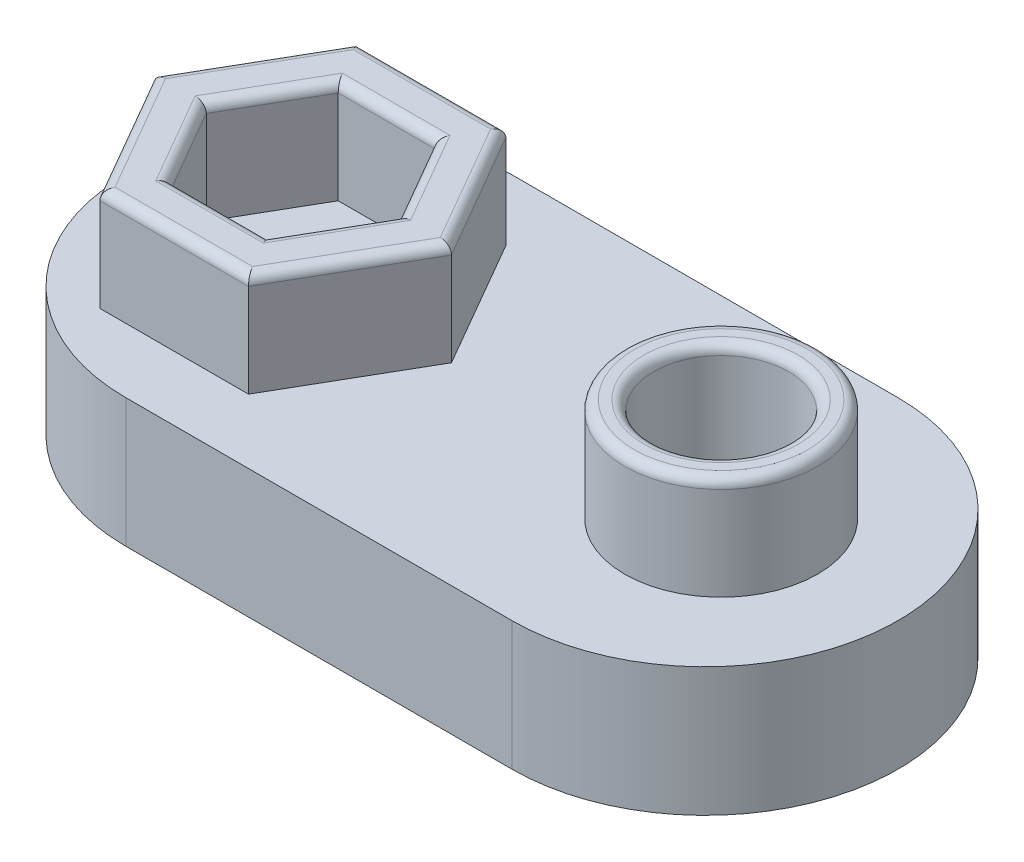
ISO-10303-21;
HEADER;
FILE_DESCRIPTION(('STEP AP214'),'2;1');
FILE_NAME('part.step','',(''),(''),'','','');
FILE_SCHEMA(('AUTOMOTIVE_DESIGN { 1 0 10303 214 1 1 1 1 }'));
ENDSEC;
DATA;
#1=APPLICATION_CONTEXT('core data for automotive mechanical design processes');
#2=APPLICATION_PROTOCOL_DEFINITION('international standard','automotive_design',2000,#1);
#3=PRODUCT_CONTEXT('',#1,'mechanical');
#4=PRODUCT('Part','Part','',(#3));
#5=PRODUCT_RELATED_PRODUCT_CATEGORY('part','',(#4));
#6=PRODUCT_DEFINITION_FORMATION('','',#4);
#7=PRODUCT_DEFINITION_CONTEXT('part definition',#1,'design');
#8=PRODUCT_DEFINITION('design','',#6,#7);
#9=PRODUCT_DEFINITION_SHAPE('','',#8);
#10=(LENGTH_UNIT() NAMED_UNIT(*) SI_UNIT(.MILLI.,.METRE.));
#11=(NAMED_UNIT(*) PLANE_ANGLE_UNIT() SI_UNIT($,.RADIAN.));
#12=(NAMED_UNIT(*) SI_UNIT($,.STERADIAN.) SOLID_ANGLE_UNIT());
#13=UNCERTAINTY_MEASURE_WITH_UNIT(LENGTH_MEASURE(1.E-05),#10,'distance_accuracy_value','');
#14=(GEOMETRIC_REPRESENTATION_CONTEXT(3) GLOBAL_UNCERTAINTY_ASSIGNED_CONTEXT((#13)) GLOBAL_UNIT_ASSIGNED_CONTEXT((#10,
#11,#12)) REPRESENTATION_CONTEXT('',''));
#15=CARTESIAN_POINT('',(0.,0.,0.));
#16=DIRECTION('',(0.,0.,1.));
#17=DIRECTION('',(1.,0.,0.));
#18=AXIS2_PLACEMENT_3D('',#15,#16,#17);
#19=CARTESIAN_POINT('',(-6.,4.,0.));
#20=DIRECTION('',(0.,-1.,0.));
#21=DIRECTION('',(0.,0.,-1.));
#22=AXIS2_PLACEMENT_3D('',#19,#20,#21);
#23=PLANE('',#22);
#24=CARTESIAN_POINT('',(6.5,4.,0.));
#25=DIRECTION('',(0.,-1.,0.));
#26=DIRECTION('',(0.,0.,-1.));
#27=AXIS2_PLACEMENT_3D('',#24,#25,#26);
#28=CIRCLE('',#27,3.);
#29=CARTESIAN_POINT('',(6.5,4.,-3.));
#30=VERTEX_POINT('',#29);
#31=EDGE_CURVE('E297',#30,#30,#28,.F.);
#32=ORIENTED_EDGE('',*,*,#31,.F.);
#33=EDGE_LOOP('',(#32));
#34=FACE_BOUND('',#33,.T.);
#35=CARTESIAN_POINT('',(-6.,4.,0.));
#36=DIRECTION('',(0.,1.,0.));
#37=DIRECTION('',(0.,0.,-1.));
#38=AXIS2_PLACEMENT_3D('',#35,#36,#37);
#39=CIRCLE('',#38,6.);
#40=CARTESIAN_POINT('',(-6.,4.,-6.));
#41=VERTEX_POINT('',#40);
#42=CARTESIAN_POINT('',(-6.,4.,6.));
#43=VERTEX_POINT('',#42);
#44=EDGE_CURVE('E268',#41,#43,#39,.T.);
#45=ORIENTED_EDGE('',*,*,#44,.T.);
#46=DIRECTION('',(1.,0.,0.));
#47=VECTOR('',#46,1.);
#48=CARTESIAN_POINT('',(6.,4.,6.));
#49=LINE('',#48,#47);
#50=CARTESIAN_POINT('',(6.,4.,6.));
#51=VERTEX_POINT('',#50);
#52=EDGE_CURVE('E271',#43,#51,#49,.T.);
#53=ORIENTED_EDGE('',*,*,#52,.T.);
#54=CARTESIAN_POINT('',(6.,4.,0.));
#55=DIRECTION('',(0.,1.,0.));
#56=DIRECTION('',(0.,0.,1.));
#57=AXIS2_PLACEMENT_3D('',#54,#55,#56);
#58=CIRCLE('',#57,6.);
#59=CARTESIAN_POINT('',(6.,4.,-6.));
#60=VERTEX_POINT('',#59);
#61=EDGE_CURVE('E274',#51,#60,#58,.T.);
#62=ORIENTED_EDGE('',*,*,#61,.T.);
#63=DIRECTION('',(-1.,0.,0.));
#64=VECTOR('',#63,1.);
#65=CARTESIAN_POINT('',(6.,4.,-6.));
#66=LINE('',#65,#64);
#67=EDGE_CURVE('E276',#60,#41,#66,.T.);
#68=ORIENTED_EDGE('',*,*,#67,.T.);
#69=EDGE_LOOP('',(#45,#53,#62,#68));
#70=FACE_BOUND('',#69,.T.);
#71=DIRECTION('',(0.5,0.,-0.866025403784439));
#72=VECTOR('',#71,1.);
#73=CARTESIAN_POINT('',(-4.19059892324149,4.,4.));
#74=LINE('',#73,#72);
#75=CARTESIAN_POINT('',(-4.19059892324149,4.,4.));
#76=VERTEX_POINT('',#75);
#77=CARTESIAN_POINT('',(-1.88119784648299,4.,0.));
#78=VERTEX_POINT('',#77);
#79=EDGE_CURVE('E197',#76,#78,#74,.T.);
#80=ORIENTED_EDGE('',*,*,#79,.F.);
#81=DIRECTION('',(1.,0.,0.));
#82=VECTOR('',#81,1.);
#83=CARTESIAN_POINT('',(-8.8094010767585,4.,4.));
#84=LINE('',#83,#82);
#85=CARTESIAN_POINT('',(-8.8094010767585,4.,4.));
#86=VERTEX_POINT('',#85);
#87=EDGE_CURVE('E249',#86,#76,#84,.T.);
#88=ORIENTED_EDGE('',*,*,#87,.F.);
#89=DIRECTION('',(0.5,0.,0.866025403784439));
#90=VECTOR('',#89,1.);
#91=CARTESIAN_POINT('',(-11.118802153517,4.,0.));
#92=LINE('',#91,#90);
#93=CARTESIAN_POINT('',(-11.118802153517,4.,0.));
#94=VERTEX_POINT('',#93);
#95=EDGE_CURVE('E246',#94,#86,#92,.T.);
#96=ORIENTED_EDGE('',*,*,#95,.F.);
#97=DIRECTION('',(-0.5,0.,0.866025403784439));
#98=VECTOR('',#97,1.);
#99=CARTESIAN_POINT('',(-8.8094010767585,4.,-4.));
#100=LINE('',#99,#98);
#101=CARTESIAN_POINT('',(-8.8094010767585,4.,-4.));
#102=VERTEX_POINT('',#101);
#103=EDGE_CURVE('E243',#102,#94,#100,.T.);
#104=ORIENTED_EDGE('',*,*,#103,.F.);
#105=DIRECTION('',(-1.,0.,0.));
#106=VECTOR('',#105,1.);
#107=CARTESIAN_POINT('',(-4.1905989232415,4.,-4.));
#108=LINE('',#107,#106);
#109=CARTESIAN_POINT('',(-4.1905989232415,4.,-4.));
#110=VERTEX_POINT('',#109);
#111=EDGE_CURVE('E240',#110,#102,#108,.T.);
#112=ORIENTED_EDGE('',*,*,#111,.F.);
#113=DIRECTION('',(-0.5,0.,-0.866025403784438));
#114=VECTOR('',#113,1.);
#115=CARTESIAN_POINT('',(-1.88119784648299,4.,0.));
#116=LINE('',#115,#114);
#117=EDGE_CURVE('E237',#78,#110,#116,.T.);
#118=ORIENTED_EDGE('',*,*,#117,.F.);
#119=EDGE_LOOP('',(#80,#88,#96,#104,#112,#118));
#120=FACE_BOUND('',#119,.T.);
#121=ADVANCED_FACE('F36',(#34,#70,#120),#23,.F.);
#122=CARTESIAN_POINT('',(-6.,4.,0.));
#123=DIRECTION('',(0.,-1.,0.));
#124=DIRECTION('',(0.,0.,-1.));
#125=AXIS2_PLACEMENT_3D('',#122,#123,#124);
#126=CYLINDRICAL_SURFACE('',#125,6.);
#127=CARTESIAN_POINT('',(-6.,0.,0.));
#128=DIRECTION('',(0.,1.,0.));
#129=DIRECTION('',(0.,0.,-1.));
#130=AXIS2_PLACEMENT_3D('',#127,#128,#129);
#131=CIRCLE('',#130,6.);
#132=CARTESIAN_POINT('',(-6.,0.,-6.));
#133=VERTEX_POINT('',#132);
#134=CARTESIAN_POINT('',(-6.,0.,6.));
#135=VERTEX_POINT('',#134);
#136=EDGE_CURVE('E267',#133,#135,#131,.T.);
#137=ORIENTED_EDGE('',*,*,#136,.T.);
#138=DIRECTION('',(0.,-1.,0.));
#139=VECTOR('',#138,1.);
#140=CARTESIAN_POINT('',(-6.,4.,6.));
#141=LINE('',#140,#139);
#142=EDGE_CURVE('E294',#43,#135,#141,.T.);
#143=ORIENTED_EDGE('',*,*,#142,.F.);
#144=ORIENTED_EDGE('',*,*,#44,.F.);
#145=DIRECTION('',(0.,-1.,0.));
#146=VECTOR('',#145,1.);
#147=CARTESIAN_POINT('',(-6.,4.,-6.));
#148=LINE('',#147,#146);
#149=EDGE_CURVE('E278',#41,#133,#148,.T.);
#150=ORIENTED_EDGE('',*,*,#149,.T.);
#151=EDGE_LOOP('',(#137,#143,#144,#150));
#152=FACE_BOUND('',#151,.T.);
#153=ADVANCED_FACE('F440',(#152),#126,.T.);
#154=CARTESIAN_POINT('',(6.,4.,6.));
#155=DIRECTION('',(0.,0.,-1.));
#156=DIRECTION('',(-1.,0.,0.));
#157=AXIS2_PLACEMENT_3D('',#154,#155,#156);
#158=PLANE('',#157);
#159=DIRECTION('',(1.,0.,0.));
#160=VECTOR('',#159,1.);
#161=CARTESIAN_POINT('',(6.,0.,6.));
#162=LINE('',#161,#160);
#163=CARTESIAN_POINT('',(6.,0.,6.));
#164=VERTEX_POINT('',#163);
#165=EDGE_CURVE('E281',#135,#164,#162,.T.);
#166=ORIENTED_EDGE('',*,*,#165,.T.);
#167=DIRECTION('',(0.,-1.,0.));
#168=VECTOR('',#167,1.);
#169=CARTESIAN_POINT('',(6.,4.,6.));
#170=LINE('',#169,#168);
#171=EDGE_CURVE('E291',#51,#164,#170,.T.);
#172=ORIENTED_EDGE('',*,*,#171,.F.);
#173=ORIENTED_EDGE('',*,*,#52,.F.);
#174=ORIENTED_EDGE('',*,*,#142,.T.);
#175=EDGE_LOOP('',(#166,#172,#173,#174));
#176=FACE_BOUND('',#175,.T.);
#177=ADVANCED_FACE('F447',(#176),#158,.F.);
#178=CARTESIAN_POINT('',(6.,4.,0.));
#179=DIRECTION('',(0.,-1.,0.));
#180=DIRECTION('',(0.,0.,-1.));
#181=AXIS2_PLACEMENT_3D('',#178,#179,#180);
#182=CYLINDRICAL_SURFACE('',#181,6.);
#183=CARTESIAN_POINT('',(6.,0.,0.));
#184=DIRECTION('',(0.,1.,0.));
#185=DIRECTION('',(0.,0.,1.));
#186=AXIS2_PLACEMENT_3D('',#183,#184,#185);
#187=CIRCLE('',#186,6.);
#188=CARTESIAN_POINT('',(6.,0.,-6.));
#189=VERTEX_POINT('',#188);
#190=EDGE_CURVE('E283',#164,#189,#187,.T.);
#191=ORIENTED_EDGE('',*,*,#190,.T.);
#192=DIRECTION('',(0.,-1.,0.));
#193=VECTOR('',#192,1.);
#194=CARTESIAN_POINT('',(6.,4.,-6.));
#195=LINE('',#194,#193);
#196=EDGE_CURVE('E288',#60,#189,#195,.T.);
#197=ORIENTED_EDGE('',*,*,#196,.F.);
#198=ORIENTED_EDGE('',*,*,#61,.F.);
#199=ORIENTED_EDGE('',*,*,#171,.T.);
#200=EDGE_LOOP('',(#191,#197,#198,#199));
#201=FACE_BOUND('',#200,.T.);
#202=ADVANCED_FACE('F661',(#201),#182,.T.);
#203=CARTESIAN_POINT('',(6.,4.,-6.));
#204=DIRECTION('',(0.,0.,1.));
#205=DIRECTION('',(1.,0.,0.));
#206=AXIS2_PLACEMENT_3D('',#203,#204,#205);
#207=PLANE('',#206);
#208=DIRECTION('',(-1.,0.,0.));
#209=VECTOR('',#208,1.);
#210=CARTESIAN_POINT('',(6.,0.,-6.));
#211=LINE('',#210,#209);
#212=EDGE_CURVE('E272',#189,#133,#211,.T.);
#213=ORIENTED_EDGE('',*,*,#212,.T.);
#214=ORIENTED_EDGE('',*,*,#149,.F.);
#215=ORIENTED_EDGE('',*,*,#67,.F.);
#216=ORIENTED_EDGE('',*,*,#196,.T.);
#217=EDGE_LOOP('',(#213,#214,#215,#216));
#218=FACE_BOUND('',#217,.T.);
#219=ADVANCED_FACE('F665',(#218),#207,.F.);
#220=CARTESIAN_POINT('',(-6.,0.,0.));
#221=DIRECTION('',(0.,-1.,0.));
#222=DIRECTION('',(0.,0.,-1.));
#223=AXIS2_PLACEMENT_3D('',#220,#221,#222);
#224=PLANE('',#223);
#225=ORIENTED_EDGE('',*,*,#136,.F.);
#226=ORIENTED_EDGE('',*,*,#212,.F.);
#227=ORIENTED_EDGE('',*,*,#190,.F.);
#228=ORIENTED_EDGE('',*,*,#165,.F.);
#229=EDGE_LOOP('',(#225,#226,#227,#228));
#230=FACE_BOUND('',#229,.T.);
#231=ADVANCED_FACE('F668',(#230),#224,.T.);
#232=CARTESIAN_POINT('',(6.5,7.2,0.));
#233=DIRECTION('',(0.,1.,0.));
#234=DIRECTION('',(0.,0.,1.));
#235=AXIS2_PLACEMENT_3D('',#232,#233,#234);
#236=PLANE('',#235);
#237=CARTESIAN_POINT('',(6.5,7.2,0.));
#238=DIRECTION('',(0.,1.,0.));
#239=DIRECTION('',(0.,0.,1.));
#240=AXIS2_PLACEMENT_3D('',#237,#238,#239);
#241=CIRCLE('',#240,2.4);
#242=CARTESIAN_POINT('',(6.5,7.2,2.4));
#243=VERTEX_POINT('',#242);
#244=EDGE_CURVE('E306',#243,#243,#241,.F.);
#245=ORIENTED_EDGE('',*,*,#244,.T.);
#246=EDGE_LOOP('',(#245));
#247=FACE_BOUND('',#246,.T.);
#248=CARTESIAN_POINT('',(6.5,7.2,0.));
#249=DIRECTION('',(0.,1.,0.));
#250=DIRECTION('',(0.,0.,1.));
#251=AXIS2_PLACEMENT_3D('',#248,#249,#250);
#252=CIRCLE('',#251,2.7);
#253=CARTESIAN_POINT('',(6.5,7.2,2.7));
#254=VERTEX_POINT('',#253);
#255=EDGE_CURVE('E303',#254,#254,#252,.T.);
#256=ORIENTED_EDGE('',*,*,#255,.T.);
#257=EDGE_LOOP('',(#256));
#258=FACE_BOUND('',#257,.T.);
#259=ADVANCED_FACE('F671',(#247,#258),#236,.T.);
#260=CARTESIAN_POINT('',(6.5,7.2,0.));
#261=DIRECTION('',(0.,-1.,0.));
#262=DIRECTION('',(0.,0.,-1.));
#263=AXIS2_PLACEMENT_3D('',#260,#261,#262);
#264=CYLINDRICAL_SURFACE('',#263,3.);
#265=CARTESIAN_POINT('',(6.5,6.9,0.));
#266=DIRECTION('',(0.,1.,0.));
#267=DIRECTION('',(0.,0.,1.));
#268=AXIS2_PLACEMENT_3D('',#265,#266,#267);
#269=CIRCLE('',#268,3.);
#270=CARTESIAN_POINT('',(6.5,6.9,3.));
#271=VERTEX_POINT('',#270);
#272=EDGE_CURVE('E309',#271,#271,#269,.F.);
#273=ORIENTED_EDGE('',*,*,#272,.T.);
#274=EDGE_LOOP('',(#273));
#275=FACE_BOUND('',#274,.T.);
#276=ORIENTED_EDGE('',*,*,#31,.T.);
#277=EDGE_LOOP('',(#276));
#278=FACE_BOUND('',#277,.T.);
#279=ADVANCED_FACE('F676',(#275,#278),#264,.T.);
#280=CARTESIAN_POINT('',(6.5,7.2,0.));
#281=DIRECTION('',(0.,-1.,0.));
#282=DIRECTION('',(0.,0.,-1.));
#283=AXIS2_PLACEMENT_3D('',#280,#281,#282);
#284=CYLINDRICAL_SURFACE('',#283,2.1);
#285=CARTESIAN_POINT('',(6.5,6.9,0.));
#286=DIRECTION('',(0.,1.,0.));
#287=DIRECTION('',(0.,0.,1.));
#288=AXIS2_PLACEMENT_3D('',#285,#286,#287);
#289=CIRCLE('',#288,2.1);
#290=CARTESIAN_POINT('',(6.5,6.9,2.1));
#291=VERTEX_POINT('',#290);
#292=EDGE_CURVE('E300',#291,#291,#289,.T.);
#293=ORIENTED_EDGE('',*,*,#292,.T.);
#294=EDGE_LOOP('',(#293));
#295=FACE_BOUND('',#294,.T.);
#296=CARTESIAN_POINT('',(6.5,4.,0.));
#297=DIRECTION('',(0.,1.,0.));
#298=DIRECTION('',(0.,0.,1.));
#299=AXIS2_PLACEMENT_3D('',#296,#297,#298);
#300=CIRCLE('',#299,2.1);
#301=CARTESIAN_POINT('',(6.5,4.,2.1));
#302=VERTEX_POINT('',#301);
#303=EDGE_CURVE('E264',#302,#302,#300,.T.);
#304=ORIENTED_EDGE('',*,*,#303,.F.);
#305=EDGE_LOOP('',(#304));
#306=FACE_BOUND('',#305,.T.);
#307=ADVANCED_FACE('F455',(#295,#306),#284,.F.);
#308=ORIENTED_EDGE('',*,*,#303,.T.);
#309=EDGE_LOOP('',(#308));
#310=FACE_BOUND('',#309,.T.);
#311=ADVANCED_FACE('F443',(#310),#23,.F.);
#312=CARTESIAN_POINT('',(0.,7.2,0.));
#313=DIRECTION('',(0.,1.,0.));
#314=DIRECTION('',(0.,0.,1.));
#315=AXIS2_PLACEMENT_3D('',#312,#313,#314);
#316=PLANE('',#315);
#317=DIRECTION('',(-0.5,0.,0.866025403784439));
#318=VECTOR('',#317,1.);
#319=CARTESIAN_POINT('',(-7.38647367097487,7.2,-4.26458256229943));
#320=LINE('',#319,#318);
#321=CARTESIAN_POINT('',(-9.84863156129983,7.2,0.));
#322=VERTEX_POINT('',#321);
#323=CARTESIAN_POINT('',(-8.17431578064991,7.2,-2.9));
#324=VERTEX_POINT('',#323);
#325=EDGE_CURVE('E336',#322,#324,#320,.F.);
#326=ORIENTED_EDGE('',*,*,#325,.T.);
#327=DIRECTION('',(-1.,0.,0.));
#328=VECTOR('',#327,1.);
#329=CARTESIAN_POINT('',(0.,7.2,-2.9));
#330=LINE('',#329,#328);
#331=CARTESIAN_POINT('',(-4.82568421935009,7.2,-2.9));
#332=VERTEX_POINT('',#331);
#333=EDGE_CURVE('E338',#324,#332,#330,.F.);
#334=ORIENTED_EDGE('',*,*,#333,.T.);
#335=DIRECTION('',(-0.5,0.,-0.866025403784439));
#336=VECTOR('',#335,1.);
#337=CARTESIAN_POINT('',(-2.36352632902513,7.2,1.36458256229943));
#338=LINE('',#337,#336);
#339=CARTESIAN_POINT('',(-3.15136843870017,7.2,0.));
#340=VERTEX_POINT('',#339);
#341=EDGE_CURVE('E328',#332,#340,#338,.F.);
#342=ORIENTED_EDGE('',*,*,#341,.T.);
#343=DIRECTION('',(0.5,0.,-0.866025403784439));
#344=VECTOR('',#343,1.);
#345=CARTESIAN_POINT('',(-2.36352632902513,7.2,-1.36458256229942));
#346=LINE('',#345,#344);
#347=CARTESIAN_POINT('',(-4.82568421935008,7.2,2.9));
#348=VERTEX_POINT('',#347);
#349=EDGE_CURVE('E330',#340,#348,#346,.F.);
#350=ORIENTED_EDGE('',*,*,#349,.T.);
#351=DIRECTION('',(1.,0.,0.));
#352=VECTOR('',#351,1.);
#353=CARTESIAN_POINT('',(0.,7.2,2.9));
#354=LINE('',#353,#352);
#355=CARTESIAN_POINT('',(-8.17431578064991,7.2,2.9));
#356=VERTEX_POINT('',#355);
#357=EDGE_CURVE('E332',#348,#356,#354,.F.);
#358=ORIENTED_EDGE('',*,*,#357,.T.);
#359=DIRECTION('',(0.5,0.,0.866025403784438));
#360=VECTOR('',#359,1.);
#361=CARTESIAN_POINT('',(-7.38647367097487,7.2,4.26458256229943));
#362=LINE('',#361,#360);
#363=EDGE_CURVE('E334',#356,#322,#362,.F.);
#364=ORIENTED_EDGE('',*,*,#363,.T.);
#365=EDGE_LOOP('',(#326,#334,#342,#350,#358,#364));
#366=FACE_BOUND('',#365,.T.);
#367=DIRECTION('',(0.5,0.,0.866025403784439));
#368=VECTOR('',#367,1.);
#369=CARTESIAN_POINT('',(-8.54959345562317,7.2,3.85));
#370=LINE('',#369,#368);
#371=CARTESIAN_POINT('',(-10.7723919920032,7.2,0.));
#372=VERTEX_POINT('',#371);
#373=CARTESIAN_POINT('',(-8.63619599600161,7.2,3.7));
#374=VERTEX_POINT('',#373);
#375=EDGE_CURVE('E323',#372,#374,#370,.T.);
#376=ORIENTED_EDGE('',*,*,#375,.T.);
#377=DIRECTION('',(1.,0.,0.));
#378=VECTOR('',#377,1.);
#379=CARTESIAN_POINT('',(-4.19059892324149,7.2,3.7));
#380=LINE('',#379,#378);
#381=CARTESIAN_POINT('',(-4.36380400399838,7.2,3.7));
#382=VERTEX_POINT('',#381);
#383=EDGE_CURVE('E325',#374,#382,#380,.T.);
#384=ORIENTED_EDGE('',*,*,#383,.T.);
#385=DIRECTION('',(0.5,0.,-0.866025403784439));
#386=VECTOR('',#385,1.);
#387=CARTESIAN_POINT('',(-2.14100546761832,7.2,-0.149999999999998));
#388=LINE('',#387,#386);
#389=CARTESIAN_POINT('',(-2.22760800799677,7.2,0.));
#390=VERTEX_POINT('',#389);
#391=EDGE_CURVE('E315',#382,#390,#388,.T.);
#392=ORIENTED_EDGE('',*,*,#391,.T.);
#393=DIRECTION('',(-0.5,0.,-0.866025403784439));
#394=VECTOR('',#393,1.);
#395=CARTESIAN_POINT('',(-4.45040654437683,7.2,-3.85));
#396=LINE('',#395,#394);
#397=CARTESIAN_POINT('',(-4.36380400399839,7.2,-3.7));
#398=VERTEX_POINT('',#397);
#399=EDGE_CURVE('E317',#390,#398,#396,.T.);
#400=ORIENTED_EDGE('',*,*,#399,.T.);
#401=DIRECTION('',(-1.,0.,0.));
#402=VECTOR('',#401,1.);
#403=CARTESIAN_POINT('',(-8.8094010767585,7.2,-3.7));
#404=LINE('',#403,#402);
#405=CARTESIAN_POINT('',(-8.63619599600161,7.2,-3.7));
#406=VERTEX_POINT('',#405);
#407=EDGE_CURVE('E319',#398,#406,#404,.T.);
#408=ORIENTED_EDGE('',*,*,#407,.T.);
#409=DIRECTION('',(-0.5,0.,0.866025403784439));
#410=VECTOR('',#409,1.);
#411=CARTESIAN_POINT('',(-10.8589945323817,7.2,0.150000000000001));
#412=LINE('',#411,#410);
#413=EDGE_CURVE('E321',#406,#372,#412,.T.);
#414=ORIENTED_EDGE('',*,*,#413,.T.);
#415=EDGE_LOOP('',(#376,#384,#392,#400,#408,#414));
#416=FACE_BOUND('',#415,.T.);
#417=ADVANCED_FACE('F437',(#366,#416),#316,.T.);
#418=CARTESIAN_POINT('',(-4.19059892324149,7.2,4.));
#419=DIRECTION('',(-0.866025403784439,0.,-0.5));
#420=DIRECTION('',(-0.5,0.,0.866025403784439));
#421=AXIS2_PLACEMENT_3D('',#418,#419,#420);
#422=PLANE('',#421);
#423=DIRECTION('',(0.,-1.,0.));
#424=VECTOR('',#423,1.);
#425=CARTESIAN_POINT('',(-1.88119784648299,7.2,0.));
#426=LINE('',#425,#424);
#427=CARTESIAN_POINT('',(-1.88119784648299,6.9,0.));
#428=VERTEX_POINT('',#427);
#429=EDGE_CURVE('E262',#428,#78,#426,.T.);
#430=ORIENTED_EDGE('',*,*,#429,.F.);
#431=DIRECTION('',(0.5,0.,-0.866025403784439));
#432=VECTOR('',#431,1.);
#433=CARTESIAN_POINT('',(-4.19059892324149,6.9,4.));
#434=LINE('',#433,#432);
#435=CARTESIAN_POINT('',(-4.19059892324149,6.9,4.));
#436=VERTEX_POINT('',#435);
#437=EDGE_CURVE('E11',#428,#436,#434,.F.);
#438=ORIENTED_EDGE('',*,*,#437,.T.);
#439=DIRECTION('',(0.,-1.,0.));
#440=VECTOR('',#439,1.);
#441=CARTESIAN_POINT('',(-4.19059892324149,7.2,4.));
#442=LINE('',#441,#440);
#443=EDGE_CURVE('E252',#436,#76,#442,.T.);
#444=ORIENTED_EDGE('',*,*,#443,.T.);
#445=ORIENTED_EDGE('',*,*,#79,.T.);
#446=EDGE_LOOP('',(#430,#438,#444,#445));
#447=FACE_BOUND('',#446,.T.);
#448=ADVANCED_FACE('F403',(#447),#422,.F.);
#449=CARTESIAN_POINT('',(-1.88119784648299,7.2,0.));
#450=DIRECTION('',(-0.866025403784438,0.,0.5));
#451=DIRECTION('',(0.5,0.,0.866025403784439));
#452=AXIS2_PLACEMENT_3D('',#449,#450,#451);
#453=PLANE('',#452);
#454=DIRECTION('',(0.,-1.,0.));
#455=VECTOR('',#454,1.);
#456=CARTESIAN_POINT('',(-4.1905989232415,7.2,-4.));
#457=LINE('',#456,#455);
#458=CARTESIAN_POINT('',(-4.1905989232415,6.9,-4.));
#459=VERTEX_POINT('',#458);
#460=EDGE_CURVE('E260',#459,#110,#457,.T.);
#461=ORIENTED_EDGE('',*,*,#460,.F.);
#462=DIRECTION('',(-0.5,0.,-0.866025403784439));
#463=VECTOR('',#462,1.);
#464=CARTESIAN_POINT('',(-1.88119784648299,6.9,0.));
#465=LINE('',#464,#463);
#466=EDGE_CURVE('E45',#459,#428,#465,.F.);
#467=ORIENTED_EDGE('',*,*,#466,.T.);
#468=ORIENTED_EDGE('',*,*,#429,.T.);
#469=ORIENTED_EDGE('',*,*,#117,.T.);
#470=EDGE_LOOP('',(#461,#467,#468,#469));
#471=FACE_BOUND('',#470,.T.);
#472=ADVANCED_FACE('F429',(#471),#453,.F.);
#473=CARTESIAN_POINT('',(-4.1905989232415,7.2,-4.));
#474=DIRECTION('',(0.,0.,1.));
#475=DIRECTION('',(1.,0.,0.));
#476=AXIS2_PLACEMENT_3D('',#473,#474,#475);
#477=PLANE('',#476);
#478=DIRECTION('',(0.,-1.,0.));
#479=VECTOR('',#478,1.);
#480=CARTESIAN_POINT('',(-8.8094010767585,7.2,-4.));
#481=LINE('',#480,#479);
#482=CARTESIAN_POINT('',(-8.8094010767585,6.9,-4.));
#483=VERTEX_POINT('',#482);
#484=EDGE_CURVE('E258',#483,#102,#481,.T.);
#485=ORIENTED_EDGE('',*,*,#484,.F.);
#486=DIRECTION('',(-1.,0.,0.));
#487=VECTOR('',#486,1.);
#488=CARTESIAN_POINT('',(-4.1905989232415,6.9,-4.));
#489=LINE('',#488,#487);
#490=EDGE_CURVE('E60',#483,#459,#489,.F.);
#491=ORIENTED_EDGE('',*,*,#490,.T.);
#492=ORIENTED_EDGE('',*,*,#460,.T.);
#493=ORIENTED_EDGE('',*,*,#111,.T.);
#494=EDGE_LOOP('',(#485,#491,#492,#493));
#495=FACE_BOUND('',#494,.T.);
#496=ADVANCED_FACE('F428',(#495),#477,.F.);
#497=CARTESIAN_POINT('',(-8.8094010767585,7.2,-4.));
#498=DIRECTION('',(0.866025403784439,0.,0.5));
#499=DIRECTION('',(0.5,0.,-0.866025403784439));
#500=AXIS2_PLACEMENT_3D('',#497,#498,#499);
#501=PLANE('',#500);
#502=DIRECTION('',(0.,-1.,0.));
#503=VECTOR('',#502,1.);
#504=CARTESIAN_POINT('',(-11.118802153517,7.2,0.));
#505=LINE('',#504,#503);
#506=CARTESIAN_POINT('',(-11.118802153517,6.9,0.));
#507=VERTEX_POINT('',#506);
#508=EDGE_CURVE('E256',#507,#94,#505,.T.);
#509=ORIENTED_EDGE('',*,*,#508,.F.);
#510=DIRECTION('',(-0.5,0.,0.866025403784439));
#511=VECTOR('',#510,1.);
#512=CARTESIAN_POINT('',(-8.8094010767585,6.9,-4.));
#513=LINE('',#512,#511);
#514=EDGE_CURVE('E355',#507,#483,#513,.F.);
#515=ORIENTED_EDGE('',*,*,#514,.T.);
#516=ORIENTED_EDGE('',*,*,#484,.T.);
#517=ORIENTED_EDGE('',*,*,#103,.T.);
#518=EDGE_LOOP('',(#509,#515,#516,#517));
#519=FACE_BOUND('',#518,.T.);
#520=ADVANCED_FACE('F423',(#519),#501,.F.);
#521=CARTESIAN_POINT('',(-11.118802153517,7.2,0.));
#522=DIRECTION('',(0.866025403784439,0.,-0.5));
#523=DIRECTION('',(-0.5,0.,-0.866025403784439));
#524=AXIS2_PLACEMENT_3D('',#521,#522,#523);
#525=PLANE('',#524);
#526=DIRECTION('',(0.,-1.,0.));
#527=VECTOR('',#526,1.);
#528=CARTESIAN_POINT('',(-8.8094010767585,7.2,4.));
#529=LINE('',#528,#527);
#530=CARTESIAN_POINT('',(-8.8094010767585,6.9,4.));
#531=VERTEX_POINT('',#530);
#532=EDGE_CURVE('E254',#531,#86,#529,.T.);
#533=ORIENTED_EDGE('',*,*,#532,.F.);
#534=DIRECTION('',(0.5,0.,0.866025403784439));
#535=VECTOR('',#534,1.);
#536=CARTESIAN_POINT('',(-11.118802153517,6.9,0.));
#537=LINE('',#536,#535);
#538=EDGE_CURVE('E353',#531,#507,#537,.F.);
#539=ORIENTED_EDGE('',*,*,#538,.T.);
#540=ORIENTED_EDGE('',*,*,#508,.T.);
#541=ORIENTED_EDGE('',*,*,#95,.T.);
#542=EDGE_LOOP('',(#533,#539,#540,#541));
#543=FACE_BOUND('',#542,.T.);
#544=ADVANCED_FACE('F420',(#543),#525,.F.);
#545=CARTESIAN_POINT('',(-8.8094010767585,7.2,4.));
#546=DIRECTION('',(0.,0.,-1.));
#547=DIRECTION('',(-1.,0.,0.));
#548=AXIS2_PLACEMENT_3D('',#545,#546,#547);
#549=PLANE('',#548);
#550=ORIENTED_EDGE('',*,*,#443,.F.);
#551=DIRECTION('',(1.,0.,0.));
#552=VECTOR('',#551,1.);
#553=CARTESIAN_POINT('',(-8.8094010767585,6.9,4.));
#554=LINE('',#553,#552);
#555=EDGE_CURVE('E350',#436,#531,#554,.F.);
#556=ORIENTED_EDGE('',*,*,#555,.T.);
#557=ORIENTED_EDGE('',*,*,#532,.T.);
#558=ORIENTED_EDGE('',*,*,#87,.T.);
#559=EDGE_LOOP('',(#550,#556,#557,#558));
#560=FACE_BOUND('',#559,.T.);
#561=ADVANCED_FACE('F407',(#560),#549,.F.);
#562=CARTESIAN_POINT('',(-4.99888930010697,7.2,2.6));
#563=DIRECTION('',(-0.866025403784439,0.,-0.5));
#564=DIRECTION('',(-0.5,0.,0.866025403784439));
#565=AXIS2_PLACEMENT_3D('',#562,#563,#564);
#566=PLANE('',#565);
#567=DIRECTION('',(0.,-1.,0.));
#568=VECTOR('',#567,1.);
#569=CARTESIAN_POINT('',(-4.99888930010697,7.2,2.6));
#570=LINE('',#569,#568);
#571=CARTESIAN_POINT('',(-4.99888930010697,6.9,2.6));
#572=VERTEX_POINT('',#571);
#573=CARTESIAN_POINT('',(-4.99888930010697,4.,2.6));
#574=VERTEX_POINT('',#573);
#575=EDGE_CURVE('E226',#572,#574,#570,.T.);
#576=ORIENTED_EDGE('',*,*,#575,.F.);
#577=DIRECTION('',(0.5,0.,-0.866025403784439));
#578=VECTOR('',#577,1.);
#579=CARTESIAN_POINT('',(-4.99888930010697,6.9,2.6));
#580=LINE('',#579,#578);
#581=CARTESIAN_POINT('',(-3.49777860021394,6.9,0.));
#582=VERTEX_POINT('',#581);
#583=EDGE_CURVE('E194',#572,#582,#580,.T.);
#584=ORIENTED_EDGE('',*,*,#583,.T.);
#585=DIRECTION('',(0.,-1.,0.));
#586=VECTOR('',#585,1.);
#587=CARTESIAN_POINT('',(-3.49777860021394,7.2,0.));
#588=LINE('',#587,#586);
#589=CARTESIAN_POINT('',(-3.49777860021394,4.,0.));
#590=VERTEX_POINT('',#589);
#591=EDGE_CURVE('E186',#582,#590,#588,.T.);
#592=ORIENTED_EDGE('',*,*,#591,.T.);
#593=DIRECTION('',(0.5,0.,-0.866025403784439));
#594=VECTOR('',#593,1.);
#595=CARTESIAN_POINT('',(-4.99888930010697,4.,2.6));
#596=LINE('',#595,#594);
#597=EDGE_CURVE('E191',#574,#590,#596,.T.);
#598=ORIENTED_EDGE('',*,*,#597,.F.);
#599=EDGE_LOOP('',(#576,#584,#592,#598));
#600=FACE_BOUND('',#599,.T.);
#601=ADVANCED_FACE('F189',(#600),#566,.T.);
#602=CARTESIAN_POINT('',(-3.49777860021394,7.2,0.));
#603=DIRECTION('',(-0.866025403784439,0.,0.5));
#604=DIRECTION('',(0.5,0.,0.866025403784439));
#605=AXIS2_PLACEMENT_3D('',#602,#603,#604);
#606=PLANE('',#605);
#607=ORIENTED_EDGE('',*,*,#591,.F.);
#608=DIRECTION('',(-0.5,0.,-0.866025403784439));
#609=VECTOR('',#608,1.);
#610=CARTESIAN_POINT('',(-3.49777860021394,6.9,0.));
#611=LINE('',#610,#609);
#612=CARTESIAN_POINT('',(-4.99888930010697,6.9,-2.6));
#613=VERTEX_POINT('',#612);
#614=EDGE_CURVE('E348',#582,#613,#611,.T.);
#615=ORIENTED_EDGE('',*,*,#614,.T.);
#616=DIRECTION('',(0.,-1.,0.));
#617=VECTOR('',#616,1.);
#618=CARTESIAN_POINT('',(-4.99888930010697,7.2,-2.6));
#619=LINE('',#618,#617);
#620=CARTESIAN_POINT('',(-4.99888930010697,4.,-2.6));
#621=VERTEX_POINT('',#620);
#622=EDGE_CURVE('E198',#613,#621,#619,.T.);
#623=ORIENTED_EDGE('',*,*,#622,.T.);
#624=DIRECTION('',(-0.5,0.,-0.866025403784439));
#625=VECTOR('',#624,1.);
#626=CARTESIAN_POINT('',(-3.49777860021394,4.,0.));
#627=LINE('',#626,#625);
#628=EDGE_CURVE('E201',#590,#621,#627,.T.);
#629=ORIENTED_EDGE('',*,*,#628,.F.);
#630=EDGE_LOOP('',(#607,#615,#623,#629));
#631=FACE_BOUND('',#630,.T.);
#632=ADVANCED_FACE('F202',(#631),#606,.T.);
#633=CARTESIAN_POINT('',(-4.99888930010697,7.2,-2.6));
#634=DIRECTION('',(0.,0.,1.));
#635=DIRECTION('',(1.,0.,0.));
#636=AXIS2_PLACEMENT_3D('',#633,#634,#635);
#637=PLANE('',#636);
#638=ORIENTED_EDGE('',*,*,#622,.F.);
#639=DIRECTION('',(-1.,0.,0.));
#640=VECTOR('',#639,1.);
#641=CARTESIAN_POINT('',(-4.99888930010697,6.9,-2.6));
#642=LINE('',#641,#640);
#643=CARTESIAN_POINT('',(-8.00111069989303,6.9,-2.6));
#644=VERTEX_POINT('',#643);
#645=EDGE_CURVE('E312',#613,#644,#642,.T.);
#646=ORIENTED_EDGE('',*,*,#645,.T.);
#647=DIRECTION('',(0.,-1.,0.));
#648=VECTOR('',#647,1.);
#649=CARTESIAN_POINT('',(-8.00111069989303,7.2,-2.6));
#650=LINE('',#649,#648);
#651=CARTESIAN_POINT('',(-8.00111069989303,4.,-2.6));
#652=VERTEX_POINT('',#651);
#653=EDGE_CURVE('E232',#644,#652,#650,.T.);
#654=ORIENTED_EDGE('',*,*,#653,.T.);
#655=DIRECTION('',(-1.,0.,0.));
#656=VECTOR('',#655,1.);
#657=CARTESIAN_POINT('',(-4.99888930010697,4.,-2.6));
#658=LINE('',#657,#656);
#659=EDGE_CURVE('E207',#621,#652,#658,.T.);
#660=ORIENTED_EDGE('',*,*,#659,.F.);
#661=EDGE_LOOP('',(#638,#646,#654,#660));
#662=FACE_BOUND('',#661,.T.);
#663=ADVANCED_FACE('F480',(#662),#637,.T.);
#664=CARTESIAN_POINT('',(-8.00111069989303,7.2,-2.6));
#665=DIRECTION('',(0.866025403784438,0.,0.5));
#666=DIRECTION('',(0.5,0.,-0.866025403784439));
#667=AXIS2_PLACEMENT_3D('',#664,#665,#666);
#668=PLANE('',#667);
#669=ORIENTED_EDGE('',*,*,#653,.F.);
#670=DIRECTION('',(-0.5,0.,0.866025403784439));
#671=VECTOR('',#670,1.);
#672=CARTESIAN_POINT('',(-8.00111069989303,6.9,-2.6));
#673=LINE('',#672,#671);
#674=CARTESIAN_POINT('',(-9.50222139978605,6.9,0.));
#675=VERTEX_POINT('',#674);
#676=EDGE_CURVE('E341',#644,#675,#673,.T.);
#677=ORIENTED_EDGE('',*,*,#676,.T.);
#678=DIRECTION('',(0.,-1.,0.));
#679=VECTOR('',#678,1.);
#680=CARTESIAN_POINT('',(-9.50222139978605,7.2,0.));
#681=LINE('',#680,#679);
#682=CARTESIAN_POINT('',(-9.50222139978605,4.,0.));
#683=VERTEX_POINT('',#682);
#684=EDGE_CURVE('E230',#675,#683,#681,.T.);
#685=ORIENTED_EDGE('',*,*,#684,.T.);
#686=DIRECTION('',(-0.5,0.,0.866025403784438));
#687=VECTOR('',#686,1.);
#688=CARTESIAN_POINT('',(-8.00111069989303,4.,-2.6));
#689=LINE('',#688,#687);
#690=EDGE_CURVE('E220',#652,#683,#689,.T.);
#691=ORIENTED_EDGE('',*,*,#690,.F.);
#692=EDGE_LOOP('',(#669,#677,#685,#691));
#693=FACE_BOUND('',#692,.T.);
#694=ADVANCED_FACE('F473',(#693),#668,.T.);
#695=CARTESIAN_POINT('',(-9.50222139978605,7.2,0.));
#696=DIRECTION('',(0.866025403784438,0.,-0.5));
#697=DIRECTION('',(-0.5,0.,-0.866025403784438));
#698=AXIS2_PLACEMENT_3D('',#695,#696,#697);
#699=PLANE('',#698);
#700=ORIENTED_EDGE('',*,*,#684,.F.);
#701=DIRECTION('',(0.5,0.,0.866025403784438));
#702=VECTOR('',#701,1.);
#703=CARTESIAN_POINT('',(-9.50222139978605,6.9,0.));
#704=LINE('',#703,#702);
#705=CARTESIAN_POINT('',(-8.00111069989302,6.9,2.6));
#706=VERTEX_POINT('',#705);
#707=EDGE_CURVE('E343',#675,#706,#704,.T.);
#708=ORIENTED_EDGE('',*,*,#707,.T.);
#709=DIRECTION('',(0.,-1.,0.));
#710=VECTOR('',#709,1.);
#711=CARTESIAN_POINT('',(-8.00111069989302,7.2,2.6));
#712=LINE('',#711,#710);
#713=CARTESIAN_POINT('',(-8.00111069989302,4.,2.6));
#714=VERTEX_POINT('',#713);
#715=EDGE_CURVE('E228',#706,#714,#712,.T.);
#716=ORIENTED_EDGE('',*,*,#715,.T.);
#717=DIRECTION('',(0.5,0.,0.866025403784438));
#718=VECTOR('',#717,1.);
#719=CARTESIAN_POINT('',(-9.50222139978605,4.,0.));
#720=LINE('',#719,#718);
#721=EDGE_CURVE('E223',#683,#714,#720,.T.);
#722=ORIENTED_EDGE('',*,*,#721,.F.);
#723=EDGE_LOOP('',(#700,#708,#716,#722));
#724=FACE_BOUND('',#723,.T.);
#725=ADVANCED_FACE('F467',(#724),#699,.T.);
#726=CARTESIAN_POINT('',(-8.00111069989302,7.2,2.6));
#727=DIRECTION('',(0.,0.,-1.));
#728=DIRECTION('',(-1.,0.,0.));
#729=AXIS2_PLACEMENT_3D('',#726,#727,#728);
#730=PLANE('',#729);
#731=ORIENTED_EDGE('',*,*,#715,.F.);
#732=DIRECTION('',(1.,0.,0.));
#733=VECTOR('',#732,1.);
#734=CARTESIAN_POINT('',(-8.00111069989302,6.9,2.6));
#735=LINE('',#734,#733);
#736=EDGE_CURVE('E345',#706,#572,#735,.T.);
#737=ORIENTED_EDGE('',*,*,#736,.T.);
#738=ORIENTED_EDGE('',*,*,#575,.T.);
#739=DIRECTION('',(1.,0.,0.));
#740=VECTOR('',#739,1.);
#741=CARTESIAN_POINT('',(-8.00111069989302,4.,2.6));
#742=LINE('',#741,#740);
#743=EDGE_CURVE('E212',#714,#574,#742,.T.);
#744=ORIENTED_EDGE('',*,*,#743,.F.);
#745=EDGE_LOOP('',(#731,#737,#738,#744));
#746=FACE_BOUND('',#745,.T.);
#747=ADVANCED_FACE('F459',(#746),#730,.T.);
#748=ORIENTED_EDGE('',*,*,#743,.T.);
#749=ORIENTED_EDGE('',*,*,#597,.T.);
#750=ORIENTED_EDGE('',*,*,#628,.T.);
#751=ORIENTED_EDGE('',*,*,#659,.T.);
#752=ORIENTED_EDGE('',*,*,#690,.T.);
#753=ORIENTED_EDGE('',*,*,#721,.T.);
#754=EDGE_LOOP('',(#748,#749,#750,#751,#752,#753));
#755=FACE_BOUND('',#754,.T.);
#756=ADVANCED_FACE('F209',(#755),#23,.F.);
#757=CARTESIAN_POINT('',(6.5,6.9,0.));
#758=DIRECTION('',(0.,1.,0.));
#759=DIRECTION('',(0.,0.,1.));
#760=AXIS2_PLACEMENT_3D('',#757,#758,#759);
#761=TOROIDAL_SURFACE('',#760,2.4,0.3);
#762=ORIENTED_EDGE('',*,*,#244,.F.);
#763=EDGE_LOOP('',(#762));
#764=FACE_BOUND('',#763,.T.);
#765=ORIENTED_EDGE('',*,*,#292,.F.);
#766=EDGE_LOOP('',(#765));
#767=FACE_BOUND('',#766,.T.);
#768=ADVANCED_FACE('F458',(#764,#767),#761,.T.);
#769=CARTESIAN_POINT('',(6.5,6.9,0.));
#770=DIRECTION('',(0.,1.,0.));
#771=DIRECTION('',(0.,0.,1.));
#772=AXIS2_PLACEMENT_3D('',#769,#770,#771);
#773=TOROIDAL_SURFACE('',#772,2.7,0.3);
#774=ORIENTED_EDGE('',*,*,#272,.F.);
#775=EDGE_LOOP('',(#774));
#776=FACE_BOUND('',#775,.T.);
#777=ORIENTED_EDGE('',*,*,#255,.F.);
#778=EDGE_LOOP('',(#777));
#779=FACE_BOUND('',#778,.T.);
#780=ADVANCED_FACE('F464',(#776,#779),#773,.T.);
#781=CARTESIAN_POINT('',(-8.00111069989302,6.9,2.9));
#782=DIRECTION('',(1.,0.,0.));
#783=DIRECTION('',(0.,0.,-1.));
#784=AXIS2_PLACEMENT_3D('',#781,#782,#783);
#785=CYLINDRICAL_SURFACE('',#784,0.3);
#786=CARTESIAN_POINT('',(-8.17431578064991,6.9,2.9));
#787=DIRECTION('',(0.866025403784439,0.,0.5));
#788=DIRECTION('',(-0.5,0.,0.866025403784439));
#789=AXIS2_PLACEMENT_3D('',#786,#787,#788);
#790=ELLIPSE('',#789,0.346410161513775,0.3);
#791=EDGE_CURVE('E216',#356,#706,#790,.F.);
#792=ORIENTED_EDGE('',*,*,#791,.F.);
#793=ORIENTED_EDGE('',*,*,#357,.F.);
#794=CARTESIAN_POINT('',(-4.82568421935008,6.9,2.9));
#795=DIRECTION('',(0.866025403784439,0.,-0.5));
#796=DIRECTION('',(0.5,0.,0.866025403784439));
#797=AXIS2_PLACEMENT_3D('',#794,#795,#796);
#798=ELLIPSE('',#797,0.346410161513775,0.3);
#799=EDGE_CURVE('E213',#572,#348,#798,.T.);
#800=ORIENTED_EDGE('',*,*,#799,.F.);
#801=ORIENTED_EDGE('',*,*,#736,.F.);
#802=EDGE_LOOP('',(#792,#793,#800,#801));
#803=FACE_BOUND('',#802,.T.);
#804=ADVANCED_FACE('F548',(#803),#785,.T.);
#805=CARTESIAN_POINT('',(-4.73908167897164,6.9,2.75));
#806=DIRECTION('',(0.5,0.,-0.866025403784439));
#807=DIRECTION('',(-0.866025403784439,0.,-0.5));
#808=AXIS2_PLACEMENT_3D('',#805,#806,#807);
#809=CYLINDRICAL_SURFACE('',#808,0.3);
#810=ORIENTED_EDGE('',*,*,#799,.T.);
#811=ORIENTED_EDGE('',*,*,#349,.F.);
#812=CARTESIAN_POINT('',(-3.15136843870017,6.9,0.));
#813=DIRECTION('',(0.,0.,-1.));
#814=DIRECTION('',(1.,0.,0.));
#815=AXIS2_PLACEMENT_3D('',#812,#813,#814);
#816=ELLIPSE('',#815,0.346410161513775,0.3);
#817=EDGE_CURVE('E366',#582,#340,#816,.T.);
#818=ORIENTED_EDGE('',*,*,#817,.F.);
#819=ORIENTED_EDGE('',*,*,#583,.F.);
#820=EDGE_LOOP('',(#810,#811,#818,#819));
#821=FACE_BOUND('',#820,.T.);
#822=ADVANCED_FACE('F558',(#821),#809,.T.);
#823=CARTESIAN_POINT('',(-9.76202902092138,6.9,0.149999999999999));
#824=DIRECTION('',(0.5,0.,0.866025403784438));
#825=DIRECTION('',(0.866025403784438,0.,-0.5));
#826=AXIS2_PLACEMENT_3D('',#823,#824,#825);
#827=CYLINDRICAL_SURFACE('',#826,0.3);
#828=ORIENTED_EDGE('',*,*,#791,.T.);
#829=ORIENTED_EDGE('',*,*,#707,.F.);
#830=CARTESIAN_POINT('',(-9.84863156129983,6.9,0.));
#831=DIRECTION('',(0.,0.,1.));
#832=DIRECTION('',(-1.,0.,0.));
#833=AXIS2_PLACEMENT_3D('',#830,#831,#832);
#834=ELLIPSE('',#833,0.346410161513776,0.3);
#835=EDGE_CURVE('E363',#322,#675,#834,.F.);
#836=ORIENTED_EDGE('',*,*,#835,.F.);
#837=ORIENTED_EDGE('',*,*,#363,.F.);
#838=EDGE_LOOP('',(#828,#829,#836,#837));
#839=FACE_BOUND('',#838,.T.);
#840=ADVANCED_FACE('F568',(#839),#827,.T.);
#841=CARTESIAN_POINT('',(-3.23797097907861,6.9,-0.149999999999998));
#842=DIRECTION('',(-0.5,0.,-0.866025403784439));
#843=DIRECTION('',(-0.866025403784439,0.,0.5));
#844=AXIS2_PLACEMENT_3D('',#841,#842,#843);
#845=CYLINDRICAL_SURFACE('',#844,0.3);
#846=ORIENTED_EDGE('',*,*,#817,.T.);
#847=ORIENTED_EDGE('',*,*,#341,.F.);
#848=CARTESIAN_POINT('',(-4.82568421935009,6.9,-2.9));
#849=DIRECTION('',(-0.866025403784439,0.,-0.5));
#850=DIRECTION('',(-0.5,0.,0.866025403784439));
#851=AXIS2_PLACEMENT_3D('',#848,#849,#850);
#852=ELLIPSE('',#851,0.346410161513775,0.3);
#853=EDGE_CURVE('E361',#613,#332,#852,.T.);
#854=ORIENTED_EDGE('',*,*,#853,.F.);
#855=ORIENTED_EDGE('',*,*,#614,.F.);
#856=EDGE_LOOP('',(#846,#847,#854,#855));
#857=FACE_BOUND('',#856,.T.);
#858=ADVANCED_FACE('F578',(#857),#845,.T.);
#859=CARTESIAN_POINT('',(-8.26091832102836,6.9,-2.75));
#860=DIRECTION('',(-0.5,0.,0.866025403784439));
#861=DIRECTION('',(0.866025403784438,0.,0.5));
#862=AXIS2_PLACEMENT_3D('',#859,#860,#861);
#863=CYLINDRICAL_SURFACE('',#862,0.3);
#864=ORIENTED_EDGE('',*,*,#835,.T.);
#865=ORIENTED_EDGE('',*,*,#676,.F.);
#866=CARTESIAN_POINT('',(-8.17431578064991,6.9,-2.9));
#867=DIRECTION('',(-0.866025403784439,0.,0.5));
#868=DIRECTION('',(-0.5,0.,-0.866025403784439));
#869=AXIS2_PLACEMENT_3D('',#866,#867,#868);
#870=ELLIPSE('',#869,0.346410161513775,0.3);
#871=EDGE_CURVE('E359',#324,#644,#870,.F.);
#872=ORIENTED_EDGE('',*,*,#871,.F.);
#873=ORIENTED_EDGE('',*,*,#325,.F.);
#874=EDGE_LOOP('',(#864,#865,#872,#873));
#875=FACE_BOUND('',#874,.T.);
#876=ADVANCED_FACE('F588',(#875),#863,.T.);
#877=CARTESIAN_POINT('',(-4.99888930010697,6.9,-2.9));
#878=DIRECTION('',(-1.,0.,0.));
#879=DIRECTION('',(0.,0.,1.));
#880=AXIS2_PLACEMENT_3D('',#877,#878,#879);
#881=CYLINDRICAL_SURFACE('',#880,0.3);
#882=ORIENTED_EDGE('',*,*,#853,.T.);
#883=ORIENTED_EDGE('',*,*,#333,.F.);
#884=ORIENTED_EDGE('',*,*,#871,.T.);
#885=ORIENTED_EDGE('',*,*,#645,.F.);
#886=EDGE_LOOP('',(#882,#883,#884,#885));
#887=FACE_BOUND('',#886,.T.);
#888=ADVANCED_FACE('F598',(#887),#881,.T.);
#889=CARTESIAN_POINT('',(0.,6.9,-3.7));
#890=DIRECTION('',(1.,0.,0.));
#891=DIRECTION('',(0.,0.,-1.));
#892=AXIS2_PLACEMENT_3D('',#889,#890,#891);
#893=CYLINDRICAL_SURFACE('',#892,0.3);
#894=CARTESIAN_POINT('',(-4.36380400399839,6.9,-3.7));
#895=DIRECTION('',(0.866025403784439,0.,0.5));
#896=DIRECTION('',(-0.5,0.,0.866025403784439));
#897=AXIS2_PLACEMENT_3D('',#894,#895,#896);
#898=ELLIPSE('',#897,0.346410161513775,0.3);
#899=EDGE_CURVE('E380',#459,#398,#898,.T.);
#900=ORIENTED_EDGE('',*,*,#899,.F.);
#901=ORIENTED_EDGE('',*,*,#490,.F.);
#902=CARTESIAN_POINT('',(-8.63619599600161,6.9,-3.7));
#903=DIRECTION('',(0.866025403784439,0.,-0.5));
#904=DIRECTION('',(0.5,0.,0.866025403784439));
#905=AXIS2_PLACEMENT_3D('',#902,#903,#904);
#906=ELLIPSE('',#905,0.346410161513775,0.3);
#907=EDGE_CURVE('E40',#406,#483,#906,.F.);
#908=ORIENTED_EDGE('',*,*,#907,.F.);
#909=ORIENTED_EDGE('',*,*,#407,.F.);
#910=EDGE_LOOP('',(#900,#901,#908,#909));
#911=FACE_BOUND('',#910,.T.);
#912=ADVANCED_FACE('F38',(#911),#893,.T.);
#913=CARTESIAN_POINT('',(-8.07929399400242,6.9,-4.66458256229942));
#914=DIRECTION('',(0.5,0.,-0.866025403784439));
#915=DIRECTION('',(-0.866025403784439,0.,-0.5));
#916=AXIS2_PLACEMENT_3D('',#913,#914,#915);
#917=CYLINDRICAL_SURFACE('',#916,0.3);
#918=ORIENTED_EDGE('',*,*,#907,.T.);
#919=ORIENTED_EDGE('',*,*,#514,.F.);
#920=CARTESIAN_POINT('',(-10.7723919920032,6.9,0.));
#921=DIRECTION('',(0.,0.,-1.));
#922=DIRECTION('',(1.,0.,0.));
#923=AXIS2_PLACEMENT_3D('',#920,#921,#922);
#924=ELLIPSE('',#923,0.346410161513775,0.3);
#925=EDGE_CURVE('E378',#372,#507,#924,.F.);
#926=ORIENTED_EDGE('',*,*,#925,.F.);
#927=ORIENTED_EDGE('',*,*,#413,.F.);
#928=EDGE_LOOP('',(#918,#919,#926,#927));
#929=FACE_BOUND('',#928,.T.);
#930=ADVANCED_FACE('F390',(#929),#917,.T.);
#931=CARTESIAN_POINT('',(-1.67070600599757,6.9,0.964582562299425));
#932=DIRECTION('',(0.5,0.,0.866025403784439));
#933=DIRECTION('',(0.866025403784439,0.,-0.5));
#934=AXIS2_PLACEMENT_3D('',#931,#932,#933);
#935=CYLINDRICAL_SURFACE('',#934,0.3);
#936=ORIENTED_EDGE('',*,*,#899,.T.);
#937=ORIENTED_EDGE('',*,*,#399,.F.);
#938=CARTESIAN_POINT('',(-2.22760800799677,6.9,0.));
#939=DIRECTION('',(0.,0.,1.));
#940=DIRECTION('',(-1.,0.,0.));
#941=AXIS2_PLACEMENT_3D('',#938,#939,#940);
#942=ELLIPSE('',#941,0.346410161513776,0.3);
#943=EDGE_CURVE('E375',#428,#390,#942,.T.);
#944=ORIENTED_EDGE('',*,*,#943,.F.);
#945=ORIENTED_EDGE('',*,*,#466,.F.);
#946=EDGE_LOOP('',(#936,#937,#944,#945));
#947=FACE_BOUND('',#946,.T.);
#948=ADVANCED_FACE('F395',(#947),#935,.T.);
#949=CARTESIAN_POINT('',(-8.07929399400242,6.9,4.66458256229943));
#950=DIRECTION('',(-0.5,0.,-0.866025403784439));
#951=DIRECTION('',(-0.866025403784439,0.,0.5));
#952=AXIS2_PLACEMENT_3D('',#949,#950,#951);
#953=CYLINDRICAL_SURFACE('',#952,0.3);
#954=ORIENTED_EDGE('',*,*,#925,.T.);
#955=ORIENTED_EDGE('',*,*,#538,.F.);
#956=CARTESIAN_POINT('',(-8.63619599600161,6.9,3.7));
#957=DIRECTION('',(-0.866025403784439,0.,-0.5));
#958=DIRECTION('',(0.5,0.,-0.866025403784439));
#959=AXIS2_PLACEMENT_3D('',#956,#957,#958);
#960=ELLIPSE('',#959,0.346410161513775,0.3);
#961=EDGE_CURVE('E373',#374,#531,#960,.F.);
#962=ORIENTED_EDGE('',*,*,#961,.F.);
#963=ORIENTED_EDGE('',*,*,#375,.F.);
#964=EDGE_LOOP('',(#954,#955,#962,#963));
#965=FACE_BOUND('',#964,.T.);
#966=ADVANCED_FACE('F417',(#965),#953,.T.);
#967=CARTESIAN_POINT('',(-1.67070600599757,6.9,-0.964582562299424));
#968=DIRECTION('',(-0.5,0.,0.866025403784439));
#969=DIRECTION('',(0.866025403784439,0.,0.5));
#970=AXIS2_PLACEMENT_3D('',#967,#968,#969);
#971=CYLINDRICAL_SURFACE('',#970,0.3);
#972=ORIENTED_EDGE('',*,*,#943,.T.);
#973=ORIENTED_EDGE('',*,*,#391,.F.);
#974=CARTESIAN_POINT('',(-4.36380400399838,6.9,3.7));
#975=DIRECTION('',(-0.866025403784439,0.,0.5));
#976=DIRECTION('',(0.5,0.,0.866025403784439));
#977=AXIS2_PLACEMENT_3D('',#974,#975,#976);
#978=ELLIPSE('',#977,0.346410161513775,0.3);
#979=EDGE_CURVE('E371',#436,#382,#978,.T.);
#980=ORIENTED_EDGE('',*,*,#979,.F.);
#981=ORIENTED_EDGE('',*,*,#437,.F.);
#982=EDGE_LOOP('',(#972,#973,#980,#981));
#983=FACE_BOUND('',#982,.T.);
#984=ADVANCED_FACE('F400',(#983),#971,.T.);
#985=CARTESIAN_POINT('',(0.,6.9,3.7));
#986=DIRECTION('',(-1.,0.,0.));
#987=DIRECTION('',(0.,0.,1.));
#988=AXIS2_PLACEMENT_3D('',#985,#986,#987);
#989=CYLINDRICAL_SURFACE('',#988,0.3);
#990=ORIENTED_EDGE('',*,*,#961,.T.);
#991=ORIENTED_EDGE('',*,*,#555,.F.);
#992=ORIENTED_EDGE('',*,*,#979,.T.);
#993=ORIENTED_EDGE('',*,*,#383,.F.);
#994=EDGE_LOOP('',(#990,#991,#992,#993));
#995=FACE_BOUND('',#994,.T.);
#996=ADVANCED_FACE('F411',(#995),#989,.T.);
#997=CLOSED_SHELL('',(#121,#153,#177,#202,#219,#231,#259,#279,#307,#311,#417,#448,#472,#496,
#520,#544,#561,#601,#632,#663,#694,#725,#747,#756,#768,#780,#804,#822,#840,#858,#876,#888,#912,
#930,#948,#966,#984,#996));
#998=MANIFOLD_SOLID_BREP('B2',#997);
#999=ADVANCED_BREP_SHAPE_REPRESENTATION('',(#18,#998),#14);
#1000=SHAPE_DEFINITION_REPRESENTATION(#9,#999);
ENDSEC;
END-ISO-10303-21;
